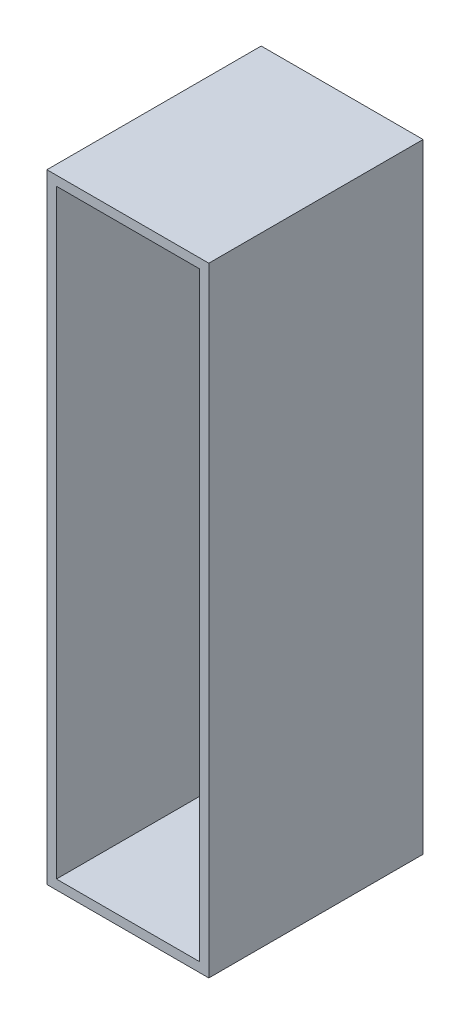
ISO-10303-21;
HEADER;
FILE_DESCRIPTION(('STEP AP214'),'2;1');
FILE_NAME('part.step','',(''),(''),'','','');
FILE_SCHEMA(('AUTOMOTIVE_DESIGN { 1 0 10303 214 1 1 1 1 }'));
ENDSEC;
DATA;
#1=APPLICATION_CONTEXT('core data for automotive mechanical design processes');
#2=APPLICATION_PROTOCOL_DEFINITION('international standard','automotive_design',2000,#1);
#3=PRODUCT_CONTEXT('',#1,'mechanical');
#4=PRODUCT('Part','Part','',(#3));
#5=PRODUCT_RELATED_PRODUCT_CATEGORY('part','',(#4));
#6=PRODUCT_DEFINITION_FORMATION('','',#4);
#7=PRODUCT_DEFINITION_CONTEXT('part definition',#1,'design');
#8=PRODUCT_DEFINITION('design','',#6,#7);
#9=PRODUCT_DEFINITION_SHAPE('','',#8);
#10=(LENGTH_UNIT() NAMED_UNIT(*) SI_UNIT(.MILLI.,.METRE.));
#11=(NAMED_UNIT(*) PLANE_ANGLE_UNIT() SI_UNIT($,.RADIAN.));
#12=(NAMED_UNIT(*) SI_UNIT($,.STERADIAN.) SOLID_ANGLE_UNIT());
#13=UNCERTAINTY_MEASURE_WITH_UNIT(LENGTH_MEASURE(1.E-05),#10,'distance_accuracy_value','');
#14=(GEOMETRIC_REPRESENTATION_CONTEXT(3) GLOBAL_UNCERTAINTY_ASSIGNED_CONTEXT((#13)) GLOBAL_UNIT_ASSIGNED_CONTEXT((#10,
#11,#12)) REPRESENTATION_CONTEXT('',''));
#15=CARTESIAN_POINT('',(0.,0.,0.));
#16=DIRECTION('',(0.,0.,1.));
#17=DIRECTION('',(1.,0.,0.));
#18=AXIS2_PLACEMENT_3D('',#15,#16,#17);
#19=CARTESIAN_POINT('',(0.,0.,45.));
#20=DIRECTION('',(0.,0.,-1.));
#21=DIRECTION('',(-1.,0.,0.));
#22=AXIS2_PLACEMENT_3D('',#19,#20,#21);
#23=PLANE('',#22);
#24=DIRECTION('',(0.,-1.,0.));
#25=VECTOR('',#24,1.);
#26=CARTESIAN_POINT('',(0.,0.,45.));
#27=LINE('',#26,#25);
#28=CARTESIAN_POINT('',(0.,130.,45.));
#29=VERTEX_POINT('',#28);
#30=CARTESIAN_POINT('',(0.,0.,45.));
#31=VERTEX_POINT('',#30);
#32=EDGE_CURVE('E141',#29,#31,#27,.T.);
#33=ORIENTED_EDGE('',*,*,#32,.T.);
#34=DIRECTION('',(1.,0.,0.));
#35=VECTOR('',#34,1.);
#36=CARTESIAN_POINT('',(0.,0.,45.));
#37=LINE('',#36,#35);
#38=CARTESIAN_POINT('',(34.,0.,45.));
#39=VERTEX_POINT('',#38);
#40=EDGE_CURVE('E143',#31,#39,#37,.T.);
#41=ORIENTED_EDGE('',*,*,#40,.T.);
#42=DIRECTION('',(0.,1.,0.));
#43=VECTOR('',#42,1.);
#44=CARTESIAN_POINT('',(34.,0.,45.));
#45=LINE('',#44,#43);
#46=CARTESIAN_POINT('',(34.,130.,45.));
#47=VERTEX_POINT('',#46);
#48=EDGE_CURVE('E150',#39,#47,#45,.T.);
#49=ORIENTED_EDGE('',*,*,#48,.T.);
#50=DIRECTION('',(-1.,0.,0.));
#51=VECTOR('',#50,1.);
#52=CARTESIAN_POINT('',(0.,130.,45.));
#53=LINE('',#52,#51);
#54=EDGE_CURVE('E146',#47,#29,#53,.T.);
#55=ORIENTED_EDGE('',*,*,#54,.T.);
#56=EDGE_LOOP('',(#33,#41,#49,#55));
#57=FACE_BOUND('',#56,.T.);
#58=DIRECTION('',(0.,-1.,0.));
#59=VECTOR('',#58,1.);
#60=CARTESIAN_POINT('',(2.,2.,45.));
#61=LINE('',#60,#59);
#62=CARTESIAN_POINT('',(2.,128.,45.));
#63=VERTEX_POINT('',#62);
#64=CARTESIAN_POINT('',(2.,2.,45.));
#65=VERTEX_POINT('',#64);
#66=EDGE_CURVE('E125',#63,#65,#61,.T.);
#67=ORIENTED_EDGE('',*,*,#66,.F.);
#68=DIRECTION('',(-1.,0.,0.));
#69=VECTOR('',#68,1.);
#70=CARTESIAN_POINT('',(2.,128.,45.));
#71=LINE('',#70,#69);
#72=CARTESIAN_POINT('',(32.,128.,45.));
#73=VERTEX_POINT('',#72);
#74=EDGE_CURVE('E115',#73,#63,#71,.T.);
#75=ORIENTED_EDGE('',*,*,#74,.F.);
#76=DIRECTION('',(0.,1.,0.));
#77=VECTOR('',#76,1.);
#78=CARTESIAN_POINT('',(32.,2.,45.));
#79=LINE('',#78,#77);
#80=CARTESIAN_POINT('',(32.,2.,45.));
#81=VERTEX_POINT('',#80);
#82=EDGE_CURVE('E135',#81,#73,#79,.T.);
#83=ORIENTED_EDGE('',*,*,#82,.F.);
#84=DIRECTION('',(1.,0.,0.));
#85=VECTOR('',#84,1.);
#86=CARTESIAN_POINT('',(2.,2.,45.));
#87=LINE('',#86,#85);
#88=EDGE_CURVE('E128',#65,#81,#87,.T.);
#89=ORIENTED_EDGE('',*,*,#88,.F.);
#90=EDGE_LOOP('',(#67,#75,#83,#89));
#91=FACE_BOUND('',#90,.T.);
#92=ADVANCED_FACE('F39',(#57,#91),#23,.F.);
#93=CARTESIAN_POINT('',(0.,0.,0.));
#94=DIRECTION('',(0.,0.,-1.));
#95=DIRECTION('',(-1.,0.,0.));
#96=AXIS2_PLACEMENT_3D('',#93,#94,#95);
#97=PLANE('',#96);
#98=DIRECTION('',(0.,-1.,0.));
#99=VECTOR('',#98,1.);
#100=CARTESIAN_POINT('',(0.,0.,0.));
#101=LINE('',#100,#99);
#102=CARTESIAN_POINT('',(0.,130.,0.));
#103=VERTEX_POINT('',#102);
#104=CARTESIAN_POINT('',(0.,0.,0.));
#105=VERTEX_POINT('',#104);
#106=EDGE_CURVE('E139',#103,#105,#101,.T.);
#107=ORIENTED_EDGE('',*,*,#106,.F.);
#108=DIRECTION('',(-1.,0.,0.));
#109=VECTOR('',#108,1.);
#110=CARTESIAN_POINT('',(0.,130.,0.));
#111=LINE('',#110,#109);
#112=CARTESIAN_POINT('',(34.,130.,0.));
#113=VERTEX_POINT('',#112);
#114=EDGE_CURVE('E144',#113,#103,#111,.T.);
#115=ORIENTED_EDGE('',*,*,#114,.F.);
#116=DIRECTION('',(0.,1.,0.));
#117=VECTOR('',#116,1.);
#118=CARTESIAN_POINT('',(34.,0.,0.));
#119=LINE('',#118,#117);
#120=CARTESIAN_POINT('',(34.,0.,0.));
#121=VERTEX_POINT('',#120);
#122=EDGE_CURVE('E157',#121,#113,#119,.T.);
#123=ORIENTED_EDGE('',*,*,#122,.F.);
#124=DIRECTION('',(1.,0.,0.));
#125=VECTOR('',#124,1.);
#126=CARTESIAN_POINT('',(0.,0.,0.));
#127=LINE('',#126,#125);
#128=EDGE_CURVE('E152',#105,#121,#127,.T.);
#129=ORIENTED_EDGE('',*,*,#128,.F.);
#130=EDGE_LOOP('',(#107,#115,#123,#129));
#131=FACE_BOUND('',#130,.T.);
#132=ADVANCED_FACE('F174',(#131),#97,.T.);
#133=CARTESIAN_POINT('',(0.,0.,45.));
#134=DIRECTION('',(1.,0.,0.));
#135=DIRECTION('',(0.,0.,-1.));
#136=AXIS2_PLACEMENT_3D('',#133,#134,#135);
#137=PLANE('',#136);
#138=ORIENTED_EDGE('',*,*,#106,.T.);
#139=DIRECTION('',(0.,0.,-1.));
#140=VECTOR('',#139,1.);
#141=CARTESIAN_POINT('',(0.,0.,45.));
#142=LINE('',#141,#140);
#143=EDGE_CURVE('E11',#31,#105,#142,.T.);
#144=ORIENTED_EDGE('',*,*,#143,.F.);
#145=ORIENTED_EDGE('',*,*,#32,.F.);
#146=DIRECTION('',(0.,0.,-1.));
#147=VECTOR('',#146,1.);
#148=CARTESIAN_POINT('',(0.,130.,45.));
#149=LINE('',#148,#147);
#150=EDGE_CURVE('E153',#29,#103,#149,.T.);
#151=ORIENTED_EDGE('',*,*,#150,.T.);
#152=EDGE_LOOP('',(#138,#144,#145,#151));
#153=FACE_BOUND('',#152,.T.);
#154=ADVANCED_FACE('F41',(#153),#137,.F.);
#155=CARTESIAN_POINT('',(0.,0.,45.));
#156=DIRECTION('',(0.,1.,0.));
#157=DIRECTION('',(0.,0.,1.));
#158=AXIS2_PLACEMENT_3D('',#155,#156,#157);
#159=PLANE('',#158);
#160=ORIENTED_EDGE('',*,*,#128,.T.);
#161=DIRECTION('',(0.,0.,-1.));
#162=VECTOR('',#161,1.);
#163=CARTESIAN_POINT('',(34.,0.,45.));
#164=LINE('',#163,#162);
#165=EDGE_CURVE('E50',#39,#121,#164,.T.);
#166=ORIENTED_EDGE('',*,*,#165,.F.);
#167=ORIENTED_EDGE('',*,*,#40,.F.);
#168=ORIENTED_EDGE('',*,*,#143,.T.);
#169=EDGE_LOOP('',(#160,#166,#167,#168));
#170=FACE_BOUND('',#169,.T.);
#171=ADVANCED_FACE('F182',(#170),#159,.F.);
#172=CARTESIAN_POINT('',(34.,0.,45.));
#173=DIRECTION('',(-1.,0.,0.));
#174=DIRECTION('',(0.,0.,1.));
#175=AXIS2_PLACEMENT_3D('',#172,#173,#174);
#176=PLANE('',#175);
#177=ORIENTED_EDGE('',*,*,#122,.T.);
#178=DIRECTION('',(0.,0.,-1.));
#179=VECTOR('',#178,1.);
#180=CARTESIAN_POINT('',(34.,130.,45.));
#181=LINE('',#180,#179);
#182=EDGE_CURVE('E163',#47,#113,#181,.T.);
#183=ORIENTED_EDGE('',*,*,#182,.F.);
#184=ORIENTED_EDGE('',*,*,#48,.F.);
#185=ORIENTED_EDGE('',*,*,#165,.T.);
#186=EDGE_LOOP('',(#177,#183,#184,#185));
#187=FACE_BOUND('',#186,.T.);
#188=ADVANCED_FACE('F166',(#187),#176,.F.);
#189=CARTESIAN_POINT('',(0.,130.,45.));
#190=DIRECTION('',(0.,-1.,0.));
#191=DIRECTION('',(0.,0.,-1.));
#192=AXIS2_PLACEMENT_3D('',#189,#190,#191);
#193=PLANE('',#192);
#194=ORIENTED_EDGE('',*,*,#114,.T.);
#195=ORIENTED_EDGE('',*,*,#150,.F.);
#196=ORIENTED_EDGE('',*,*,#54,.F.);
#197=ORIENTED_EDGE('',*,*,#182,.T.);
#198=EDGE_LOOP('',(#194,#195,#196,#197));
#199=FACE_BOUND('',#198,.T.);
#200=ADVANCED_FACE('F180',(#199),#193,.F.);
#201=CARTESIAN_POINT('',(2.,2.,45.));
#202=DIRECTION('',(1.,0.,0.));
#203=DIRECTION('',(0.,0.,-1.));
#204=AXIS2_PLACEMENT_3D('',#201,#202,#203);
#205=PLANE('',#204);
#206=DIRECTION('',(0.,-1.,0.));
#207=VECTOR('',#206,1.);
#208=CARTESIAN_POINT('',(2.,2.,2.));
#209=LINE('',#208,#207);
#210=CARTESIAN_POINT('',(2.,128.,2.));
#211=VERTEX_POINT('',#210);
#212=CARTESIAN_POINT('',(2.,2.,2.00000000000002));
#213=VERTEX_POINT('',#212);
#214=EDGE_CURVE('E116',#211,#213,#209,.T.);
#215=ORIENTED_EDGE('',*,*,#214,.F.);
#216=DIRECTION('',(0.,0.,-1.));
#217=VECTOR('',#216,1.);
#218=CARTESIAN_POINT('',(2.,128.,45.));
#219=LINE('',#218,#217);
#220=EDGE_CURVE('E108',#63,#211,#219,.T.);
#221=ORIENTED_EDGE('',*,*,#220,.F.);
#222=ORIENTED_EDGE('',*,*,#66,.T.);
#223=DIRECTION('',(0.,0.,-1.));
#224=VECTOR('',#223,1.);
#225=CARTESIAN_POINT('',(2.,2.,45.));
#226=LINE('',#225,#224);
#227=EDGE_CURVE('E119',#65,#213,#226,.T.);
#228=ORIENTED_EDGE('',*,*,#227,.T.);
#229=EDGE_LOOP('',(#215,#221,#222,#228));
#230=FACE_BOUND('',#229,.T.);
#231=ADVANCED_FACE('F117',(#230),#205,.T.);
#232=CARTESIAN_POINT('',(2.,2.,45.));
#233=DIRECTION('',(0.,1.,0.));
#234=DIRECTION('',(0.,0.,1.));
#235=AXIS2_PLACEMENT_3D('',#232,#233,#234);
#236=PLANE('',#235);
#237=DIRECTION('',(1.,0.,0.));
#238=VECTOR('',#237,1.);
#239=CARTESIAN_POINT('',(2.,2.,2.));
#240=LINE('',#239,#238);
#241=CARTESIAN_POINT('',(32.,2.,2.00000000000002));
#242=VERTEX_POINT('',#241);
#243=EDGE_CURVE('E53',#213,#242,#240,.T.);
#244=ORIENTED_EDGE('',*,*,#243,.F.);
#245=ORIENTED_EDGE('',*,*,#227,.F.);
#246=ORIENTED_EDGE('',*,*,#88,.T.);
#247=DIRECTION('',(0.,0.,-1.));
#248=VECTOR('',#247,1.);
#249=CARTESIAN_POINT('',(32.,2.,45.));
#250=LINE('',#249,#248);
#251=EDGE_CURVE('E140',#81,#242,#250,.T.);
#252=ORIENTED_EDGE('',*,*,#251,.T.);
#253=EDGE_LOOP('',(#244,#245,#246,#252));
#254=FACE_BOUND('',#253,.T.);
#255=ADVANCED_FACE('F204',(#254),#236,.T.);
#256=CARTESIAN_POINT('',(32.,2.,45.));
#257=DIRECTION('',(-1.,0.,0.));
#258=DIRECTION('',(0.,0.,1.));
#259=AXIS2_PLACEMENT_3D('',#256,#257,#258);
#260=PLANE('',#259);
#261=DIRECTION('',(0.,1.,0.));
#262=VECTOR('',#261,1.);
#263=CARTESIAN_POINT('',(32.,2.,2.));
#264=LINE('',#263,#262);
#265=CARTESIAN_POINT('',(32.,128.,2.00000000000002));
#266=VERTEX_POINT('',#265);
#267=EDGE_CURVE('E65',#242,#266,#264,.T.);
#268=ORIENTED_EDGE('',*,*,#267,.F.);
#269=ORIENTED_EDGE('',*,*,#251,.F.);
#270=ORIENTED_EDGE('',*,*,#82,.T.);
#271=DIRECTION('',(0.,0.,-1.));
#272=VECTOR('',#271,1.);
#273=CARTESIAN_POINT('',(32.,128.,45.));
#274=LINE('',#273,#272);
#275=EDGE_CURVE('E113',#73,#266,#274,.T.);
#276=ORIENTED_EDGE('',*,*,#275,.T.);
#277=EDGE_LOOP('',(#268,#269,#270,#276));
#278=FACE_BOUND('',#277,.T.);
#279=ADVANCED_FACE('F206',(#278),#260,.T.);
#280=CARTESIAN_POINT('',(2.,128.,45.));
#281=DIRECTION('',(0.,-1.,0.));
#282=DIRECTION('',(0.,0.,-1.));
#283=AXIS2_PLACEMENT_3D('',#280,#281,#282);
#284=PLANE('',#283);
#285=DIRECTION('',(-1.,0.,0.));
#286=VECTOR('',#285,1.);
#287=CARTESIAN_POINT('',(2.,128.,2.));
#288=LINE('',#287,#286);
#289=EDGE_CURVE('E109',#266,#211,#288,.T.);
#290=ORIENTED_EDGE('',*,*,#289,.F.);
#291=ORIENTED_EDGE('',*,*,#275,.F.);
#292=ORIENTED_EDGE('',*,*,#74,.T.);
#293=ORIENTED_EDGE('',*,*,#220,.T.);
#294=EDGE_LOOP('',(#290,#291,#292,#293));
#295=FACE_BOUND('',#294,.T.);
#296=ADVANCED_FACE('F106',(#295),#284,.T.);
#297=CARTESIAN_POINT('',(0.,0.,2.));
#298=DIRECTION('',(0.,0.,-1.));
#299=DIRECTION('',(-1.,0.,0.));
#300=AXIS2_PLACEMENT_3D('',#297,#298,#299);
#301=PLANE('',#300);
#302=ORIENTED_EDGE('',*,*,#214,.T.);
#303=ORIENTED_EDGE('',*,*,#243,.T.);
#304=ORIENTED_EDGE('',*,*,#267,.T.);
#305=ORIENTED_EDGE('',*,*,#289,.T.);
#306=EDGE_LOOP('',(#302,#303,#304,#305));
#307=FACE_BOUND('',#306,.T.);
#308=ADVANCED_FACE('F121',(#307),#301,.F.);
#309=CLOSED_SHELL('',(#92,#132,#154,#171,#188,#200,#231,#255,#279,#296,#308));
#310=MANIFOLD_SOLID_BREP('B2',#309);
#311=ADVANCED_BREP_SHAPE_REPRESENTATION('',(#18,#310),#14);
#312=SHAPE_DEFINITION_REPRESENTATION(#9,#311);
ENDSEC;
END-ISO-10303-21;
